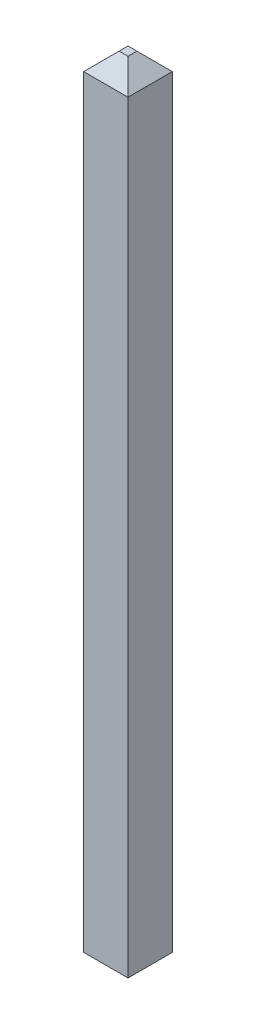
ISO-10303-21;
HEADER;
FILE_DESCRIPTION(('STEP AP214'),'2;1');
FILE_NAME('part.step','',(''),(''),'','','');
FILE_SCHEMA(('AUTOMOTIVE_DESIGN { 1 0 10303 214 1 1 1 1 }'));
ENDSEC;
DATA;
#1=APPLICATION_CONTEXT('core data for automotive mechanical design processes');
#2=APPLICATION_PROTOCOL_DEFINITION('international standard','automotive_design',2000,#1);
#3=PRODUCT_CONTEXT('',#1,'mechanical');
#4=PRODUCT('Part','Part','',(#3));
#5=PRODUCT_RELATED_PRODUCT_CATEGORY('part','',(#4));
#6=PRODUCT_DEFINITION_FORMATION('','',#4);
#7=PRODUCT_DEFINITION_CONTEXT('part definition',#1,'design');
#8=PRODUCT_DEFINITION('design','',#6,#7);
#9=PRODUCT_DEFINITION_SHAPE('','',#8);
#10=(LENGTH_UNIT() NAMED_UNIT(*) SI_UNIT(.MILLI.,.METRE.));
#11=(NAMED_UNIT(*) PLANE_ANGLE_UNIT() SI_UNIT($,.RADIAN.));
#12=(NAMED_UNIT(*) SI_UNIT($,.STERADIAN.) SOLID_ANGLE_UNIT());
#13=UNCERTAINTY_MEASURE_WITH_UNIT(LENGTH_MEASURE(1.E-05),#10,'distance_accuracy_value','');
#14=(GEOMETRIC_REPRESENTATION_CONTEXT(3) GLOBAL_UNCERTAINTY_ASSIGNED_CONTEXT((#13)) GLOBAL_UNIT_ASSIGNED_CONTEXT((#10,
#11,#12)) REPRESENTATION_CONTEXT('',''));
#15=CARTESIAN_POINT('',(0.,0.,0.));
#16=DIRECTION('',(0.,0.,1.));
#17=DIRECTION('',(1.,0.,0.));
#18=AXIS2_PLACEMENT_3D('',#15,#16,#17);
#19=CARTESIAN_POINT('',(-0.3175,11.43,-0.3175));
#20=DIRECTION('',(1.,0.,0.));
#21=DIRECTION('',(0.,0.,-1.));
#22=AXIS2_PLACEMENT_3D('',#19,#20,#21);
#23=PLANE('',#22);
#24=DIRECTION('',(0.,-1.,0.));
#25=VECTOR('',#24,1.);
#26=CARTESIAN_POINT('',(-0.3175,11.43,-0.3175));
#27=LINE('',#26,#25);
#28=CARTESIAN_POINT('',(-0.3175,11.176,-0.3175));
#29=VERTEX_POINT('',#28);
#30=CARTESIAN_POINT('',(-0.3175,0.254000000000001,-0.3175));
#31=VERTEX_POINT('',#30);
#32=EDGE_CURVE('E143',#29,#31,#27,.T.);
#33=ORIENTED_EDGE('',*,*,#32,.T.);
#34=DIRECTION('',(0.,0.,1.));
#35=VECTOR('',#34,1.);
#36=CARTESIAN_POINT('',(-0.3175,0.254000000000001,-0.3175));
#37=LINE('',#36,#35);
#38=CARTESIAN_POINT('',(-0.3175,0.254000000000001,0.3175));
#39=VERTEX_POINT('',#38);
#40=EDGE_CURVE('E136',#31,#39,#37,.T.);
#41=ORIENTED_EDGE('',*,*,#40,.T.);
#42=DIRECTION('',(0.,-1.,0.));
#43=VECTOR('',#42,1.);
#44=CARTESIAN_POINT('',(-0.3175,11.43,0.3175));
#45=LINE('',#44,#43);
#46=CARTESIAN_POINT('',(-0.3175,11.176,0.3175));
#47=VERTEX_POINT('',#46);
#48=EDGE_CURVE('E120',#47,#39,#45,.T.);
#49=ORIENTED_EDGE('',*,*,#48,.F.);
#50=DIRECTION('',(0.,0.,-1.));
#51=VECTOR('',#50,1.);
#52=CARTESIAN_POINT('',(-0.3175,11.176,-0.3175));
#53=LINE('',#52,#51);
#54=EDGE_CURVE('E135',#47,#29,#53,.T.);
#55=ORIENTED_EDGE('',*,*,#54,.T.);
#56=EDGE_LOOP('',(#33,#41,#49,#55));
#57=FACE_BOUND('',#56,.T.);
#58=ADVANCED_FACE('F33',(#57),#23,.F.);
#59=CARTESIAN_POINT('',(-0.3175,11.43,0.3175));
#60=DIRECTION('',(0.,0.,-1.));
#61=DIRECTION('',(-1.,0.,0.));
#62=AXIS2_PLACEMENT_3D('',#59,#60,#61);
#63=PLANE('',#62);
#64=ORIENTED_EDGE('',*,*,#48,.T.);
#65=DIRECTION('',(1.,0.,0.));
#66=VECTOR('',#65,1.);
#67=CARTESIAN_POINT('',(-0.3175,0.254000000000001,0.3175));
#68=LINE('',#67,#66);
#69=CARTESIAN_POINT('',(0.3175,0.254000000000001,0.3175));
#70=VERTEX_POINT('',#69);
#71=EDGE_CURVE('E11',#39,#70,#68,.T.);
#72=ORIENTED_EDGE('',*,*,#71,.T.);
#73=DIRECTION('',(0.,-1.,0.));
#74=VECTOR('',#73,1.);
#75=CARTESIAN_POINT('',(0.3175,11.43,0.3175));
#76=LINE('',#75,#74);
#77=CARTESIAN_POINT('',(0.3175,11.176,0.3175));
#78=VERTEX_POINT('',#77);
#79=EDGE_CURVE('E189',#78,#70,#76,.T.);
#80=ORIENTED_EDGE('',*,*,#79,.F.);
#81=DIRECTION('',(-1.,0.,0.));
#82=VECTOR('',#81,1.);
#83=CARTESIAN_POINT('',(-0.3175,11.176,0.3175));
#84=LINE('',#83,#82);
#85=EDGE_CURVE('E133',#78,#47,#84,.T.);
#86=ORIENTED_EDGE('',*,*,#85,.T.);
#87=EDGE_LOOP('',(#64,#72,#80,#86));
#88=FACE_BOUND('',#87,.T.);
#89=ADVANCED_FACE('F187',(#88),#63,.F.);
#90=CARTESIAN_POINT('',(0.3175,11.43,-0.3175));
#91=DIRECTION('',(-1.,0.,0.));
#92=DIRECTION('',(0.,0.,1.));
#93=AXIS2_PLACEMENT_3D('',#90,#91,#92);
#94=PLANE('',#93);
#95=ORIENTED_EDGE('',*,*,#79,.T.);
#96=DIRECTION('',(0.,0.,-1.));
#97=VECTOR('',#96,1.);
#98=CARTESIAN_POINT('',(0.3175,0.254000000000001,-0.3175));
#99=LINE('',#98,#97);
#100=CARTESIAN_POINT('',(0.3175,0.254000000000001,-0.3175));
#101=VERTEX_POINT('',#100);
#102=EDGE_CURVE('E42',#70,#101,#99,.T.);
#103=ORIENTED_EDGE('',*,*,#102,.T.);
#104=DIRECTION('',(0.,-1.,0.));
#105=VECTOR('',#104,1.);
#106=CARTESIAN_POINT('',(0.3175,11.43,-0.3175));
#107=LINE('',#106,#105);
#108=CARTESIAN_POINT('',(0.3175,11.176,-0.3175));
#109=VERTEX_POINT('',#108);
#110=EDGE_CURVE('E191',#109,#101,#107,.T.);
#111=ORIENTED_EDGE('',*,*,#110,.F.);
#112=DIRECTION('',(0.,0.,1.));
#113=VECTOR('',#112,1.);
#114=CARTESIAN_POINT('',(0.3175,11.176,0.3175));
#115=LINE('',#114,#113);
#116=EDGE_CURVE('E127',#109,#78,#115,.T.);
#117=ORIENTED_EDGE('',*,*,#116,.T.);
#118=EDGE_LOOP('',(#95,#103,#111,#117));
#119=FACE_BOUND('',#118,.T.);
#120=ADVANCED_FACE('F202',(#119),#94,.F.);
#121=CARTESIAN_POINT('',(-0.3175,11.43,-0.3175));
#122=DIRECTION('',(0.,0.,1.));
#123=DIRECTION('',(1.,0.,0.));
#124=AXIS2_PLACEMENT_3D('',#121,#122,#123);
#125=PLANE('',#124);
#126=ORIENTED_EDGE('',*,*,#110,.T.);
#127=DIRECTION('',(-1.,0.,0.));
#128=VECTOR('',#127,1.);
#129=CARTESIAN_POINT('',(-0.3175,0.254000000000001,-0.3175));
#130=LINE('',#129,#128);
#131=EDGE_CURVE('E155',#101,#31,#130,.T.);
#132=ORIENTED_EDGE('',*,*,#131,.T.);
#133=ORIENTED_EDGE('',*,*,#32,.F.);
#134=DIRECTION('',(1.,0.,0.));
#135=VECTOR('',#134,1.);
#136=CARTESIAN_POINT('',(0.3175,11.176,-0.3175));
#137=LINE('',#136,#135);
#138=EDGE_CURVE('E107',#29,#109,#137,.T.);
#139=ORIENTED_EDGE('',*,*,#138,.T.);
#140=EDGE_LOOP('',(#126,#132,#133,#139));
#141=FACE_BOUND('',#140,.T.);
#142=ADVANCED_FACE('F201',(#141),#125,.F.);
#143=CARTESIAN_POINT('',(-0.3175,11.43,0.3175));
#144=DIRECTION('',(0.,1.,0.));
#145=DIRECTION('',(0.,0.,1.));
#146=AXIS2_PLACEMENT_3D('',#143,#144,#145);
#147=PLANE('',#146);
#148=DIRECTION('',(0.,0.,-1.));
#149=VECTOR('',#148,1.);
#150=CARTESIAN_POINT('',(0.0635000000000009,11.43,-0.3175));
#151=LINE('',#150,#149);
#152=CARTESIAN_POINT('',(0.0635000000000009,11.43,0.063500000000001));
#153=VERTEX_POINT('',#152);
#154=CARTESIAN_POINT('',(0.0635000000000009,11.43,-0.063500000000001));
#155=VERTEX_POINT('',#154);
#156=EDGE_CURVE('E124',#153,#155,#151,.T.);
#157=ORIENTED_EDGE('',*,*,#156,.T.);
#158=DIRECTION('',(-1.,0.,0.));
#159=VECTOR('',#158,1.);
#160=CARTESIAN_POINT('',(-0.3175,11.43,-0.063500000000001));
#161=LINE('',#160,#159);
#162=CARTESIAN_POINT('',(-0.0635000000000011,11.43,-0.063500000000001));
#163=VERTEX_POINT('',#162);
#164=EDGE_CURVE('E105',#155,#163,#161,.T.);
#165=ORIENTED_EDGE('',*,*,#164,.T.);
#166=DIRECTION('',(0.,0.,1.));
#167=VECTOR('',#166,1.);
#168=CARTESIAN_POINT('',(-0.0635000000000011,11.43,0.3175));
#169=LINE('',#168,#167);
#170=CARTESIAN_POINT('',(-0.0635000000000011,11.43,0.063500000000001));
#171=VERTEX_POINT('',#170);
#172=EDGE_CURVE('E113',#163,#171,#169,.T.);
#173=ORIENTED_EDGE('',*,*,#172,.T.);
#174=DIRECTION('',(1.,0.,0.));
#175=VECTOR('',#174,1.);
#176=CARTESIAN_POINT('',(0.3175,11.43,0.063500000000001));
#177=LINE('',#176,#175);
#178=EDGE_CURVE('E119',#171,#153,#177,.T.);
#179=ORIENTED_EDGE('',*,*,#178,.T.);
#180=EDGE_LOOP('',(#157,#165,#173,#179));
#181=FACE_BOUND('',#180,.T.);
#182=ADVANCED_FACE('F122',(#181),#147,.T.);
#183=CARTESIAN_POINT('',(-0.3175,0.,0.3175));
#184=DIRECTION('',(0.,1.,0.));
#185=DIRECTION('',(0.,0.,1.));
#186=AXIS2_PLACEMENT_3D('',#183,#184,#185);
#187=PLANE('',#186);
#188=DIRECTION('',(-1.,0.,0.));
#189=VECTOR('',#188,1.);
#190=CARTESIAN_POINT('',(-0.3175,0.,0.0634999999999976));
#191=LINE('',#190,#189);
#192=CARTESIAN_POINT('',(0.0634999999999974,0.,0.0634999999999976));
#193=VERTEX_POINT('',#192);
#194=CARTESIAN_POINT('',(-0.0634999999999977,0.,0.0634999999999976));
#195=VERTEX_POINT('',#194);
#196=EDGE_CURVE('E146',#193,#195,#191,.T.);
#197=ORIENTED_EDGE('',*,*,#196,.T.);
#198=DIRECTION('',(0.,0.,-1.));
#199=VECTOR('',#198,1.);
#200=CARTESIAN_POINT('',(-0.0634999999999976,0.,0.3175));
#201=LINE('',#200,#199);
#202=CARTESIAN_POINT('',(-0.0634999999999977,0.,-0.0634999999999976));
#203=VERTEX_POINT('',#202);
#204=EDGE_CURVE('E152',#195,#203,#201,.T.);
#205=ORIENTED_EDGE('',*,*,#204,.T.);
#206=DIRECTION('',(1.,0.,0.));
#207=VECTOR('',#206,1.);
#208=CARTESIAN_POINT('',(-0.3175,0.,-0.0634999999999976));
#209=LINE('',#208,#207);
#210=CARTESIAN_POINT('',(0.0634999999999974,0.,-0.0634999999999976));
#211=VERTEX_POINT('',#210);
#212=EDGE_CURVE('E150',#203,#211,#209,.T.);
#213=ORIENTED_EDGE('',*,*,#212,.T.);
#214=DIRECTION('',(0.,0.,1.));
#215=VECTOR('',#214,1.);
#216=CARTESIAN_POINT('',(0.0634999999999975,0.,0.3175));
#217=LINE('',#216,#215);
#218=EDGE_CURVE('E148',#211,#193,#217,.T.);
#219=ORIENTED_EDGE('',*,*,#218,.T.);
#220=EDGE_LOOP('',(#197,#205,#213,#219));
#221=FACE_BOUND('',#220,.T.);
#222=ADVANCED_FACE('F176',(#221),#187,.F.);
#223=CARTESIAN_POINT('',(-0.3175,11.43,0.063500000000001));
#224=DIRECTION('',(0.,0.707106781186545,0.70710678118655));
#225=DIRECTION('',(0.,-0.70710678118655,0.707106781186545));
#226=AXIS2_PLACEMENT_3D('',#223,#224,#225);
#227=PLANE('',#226);
#228=DIRECTION('',(0.577350269189624,0.577350269189628,-0.577350269189624));
#229=VECTOR('',#228,1.);
#230=CARTESIAN_POINT('',(-0.148166666666667,11.3453333333333,0.148166666666667));
#231=LINE('',#230,#229);
#232=EDGE_CURVE('E116',#47,#171,#231,.T.);
#233=ORIENTED_EDGE('',*,*,#232,.F.);
#234=ORIENTED_EDGE('',*,*,#85,.F.);
#235=DIRECTION('',(-0.577350269189625,0.577350269189628,-0.577350269189624));
#236=VECTOR('',#235,1.);
#237=CARTESIAN_POINT('',(-0.0634999999999988,11.557,-0.0634999999999988));
#238=LINE('',#237,#236);
#239=EDGE_CURVE('E140',#153,#78,#238,.F.);
#240=ORIENTED_EDGE('',*,*,#239,.F.);
#241=ORIENTED_EDGE('',*,*,#178,.F.);
#242=EDGE_LOOP('',(#233,#234,#240,#241));
#243=FACE_BOUND('',#242,.T.);
#244=ADVANCED_FACE('F196',(#243),#227,.T.);
#245=CARTESIAN_POINT('',(0.0635000000000009,11.43,0.3175));
#246=DIRECTION('',(0.70710678118655,0.707106781186545,0.));
#247=DIRECTION('',(-0.707106781186545,0.70710678118655,0.));
#248=AXIS2_PLACEMENT_3D('',#245,#246,#247);
#249=PLANE('',#248);
#250=ORIENTED_EDGE('',*,*,#239,.T.);
#251=ORIENTED_EDGE('',*,*,#116,.F.);
#252=DIRECTION('',(-0.577350269189624,0.577350269189628,0.577350269189624));
#253=VECTOR('',#252,1.);
#254=CARTESIAN_POINT('',(-0.0634999999999988,11.557,0.0634999999999987));
#255=LINE('',#254,#253);
#256=EDGE_CURVE('E110',#155,#109,#255,.F.);
#257=ORIENTED_EDGE('',*,*,#256,.F.);
#258=ORIENTED_EDGE('',*,*,#156,.F.);
#259=EDGE_LOOP('',(#250,#251,#257,#258));
#260=FACE_BOUND('',#259,.T.);
#261=ADVANCED_FACE('F199',(#260),#249,.T.);
#262=CARTESIAN_POINT('',(-0.0635000000000011,11.43,0.3175));
#263=DIRECTION('',(-0.70710678118655,0.707106781186545,0.));
#264=DIRECTION('',(-0.707106781186545,-0.70710678118655,0.));
#265=AXIS2_PLACEMENT_3D('',#262,#263,#264);
#266=PLANE('',#265);
#267=ORIENTED_EDGE('',*,*,#232,.T.);
#268=ORIENTED_EDGE('',*,*,#172,.F.);
#269=DIRECTION('',(-0.577350269189625,-0.577350269189628,-0.577350269189624));
#270=VECTOR('',#269,1.);
#271=CARTESIAN_POINT('',(0.0634999999999987,11.557,0.0634999999999987));
#272=LINE('',#271,#270);
#273=EDGE_CURVE('E101',#29,#163,#272,.F.);
#274=ORIENTED_EDGE('',*,*,#273,.F.);
#275=ORIENTED_EDGE('',*,*,#54,.F.);
#276=EDGE_LOOP('',(#267,#268,#274,#275));
#277=FACE_BOUND('',#276,.T.);
#278=ADVANCED_FACE('F114',(#277),#266,.T.);
#279=CARTESIAN_POINT('',(-0.3175,11.43,-0.063500000000001));
#280=DIRECTION('',(0.,0.707106781186545,-0.70710678118655));
#281=DIRECTION('',(0.,0.70710678118655,0.707106781186545));
#282=AXIS2_PLACEMENT_3D('',#279,#280,#281);
#283=PLANE('',#282);
#284=ORIENTED_EDGE('',*,*,#256,.T.);
#285=ORIENTED_EDGE('',*,*,#138,.F.);
#286=ORIENTED_EDGE('',*,*,#273,.T.);
#287=ORIENTED_EDGE('',*,*,#164,.F.);
#288=EDGE_LOOP('',(#284,#285,#286,#287));
#289=FACE_BOUND('',#288,.T.);
#290=ADVANCED_FACE('F103',(#289),#283,.T.);
#291=CARTESIAN_POINT('',(0.3175,0.254000000000001,-0.3175));
#292=DIRECTION('',(-0.707106781186545,0.70710678118655,0.));
#293=DIRECTION('',(-0.70710678118655,-0.707106781186545,0.));
#294=AXIS2_PLACEMENT_3D('',#291,#292,#293);
#295=PLANE('',#294);
#296=DIRECTION('',(0.577350269189627,0.577350269189623,0.577350269189627));
#297=VECTOR('',#296,1.);
#298=CARTESIAN_POINT('',(0.105833333333332,0.0423333333333345,0.105833333333332));
#299=LINE('',#298,#297);
#300=EDGE_CURVE('E161',#193,#70,#299,.T.);
#301=ORIENTED_EDGE('',*,*,#300,.F.);
#302=ORIENTED_EDGE('',*,*,#218,.F.);
#303=DIRECTION('',(0.577350269189627,0.577350269189623,-0.577350269189627));
#304=VECTOR('',#303,1.);
#305=CARTESIAN_POINT('',(0.3175,0.254000000000001,-0.3175));
#306=LINE('',#305,#304);
#307=EDGE_CURVE('E37',#101,#211,#306,.F.);
#308=ORIENTED_EDGE('',*,*,#307,.F.);
#309=ORIENTED_EDGE('',*,*,#102,.F.);
#310=EDGE_LOOP('',(#301,#302,#308,#309));
#311=FACE_BOUND('',#310,.T.);
#312=ADVANCED_FACE('F35',(#311),#295,.F.);
#313=CARTESIAN_POINT('',(-0.3175,0.254000000000001,-0.3175));
#314=DIRECTION('',(0.,0.70710678118655,0.707106781186545));
#315=DIRECTION('',(0.,-0.707106781186545,0.70710678118655));
#316=AXIS2_PLACEMENT_3D('',#313,#314,#315);
#317=PLANE('',#316);
#318=ORIENTED_EDGE('',*,*,#307,.T.);
#319=ORIENTED_EDGE('',*,*,#212,.F.);
#320=DIRECTION('',(-0.577350269189627,0.577350269189623,-0.577350269189627));
#321=VECTOR('',#320,1.);
#322=CARTESIAN_POINT('',(-0.3175,0.254000000000001,-0.3175));
#323=LINE('',#322,#321);
#324=EDGE_CURVE('E160',#31,#203,#323,.F.);
#325=ORIENTED_EDGE('',*,*,#324,.F.);
#326=ORIENTED_EDGE('',*,*,#131,.F.);
#327=EDGE_LOOP('',(#318,#319,#325,#326));
#328=FACE_BOUND('',#327,.T.);
#329=ADVANCED_FACE('F171',(#328),#317,.F.);
#330=CARTESIAN_POINT('',(-0.3175,0.254000000000001,0.3175));
#331=DIRECTION('',(0.,0.70710678118655,-0.707106781186545));
#332=DIRECTION('',(0.,0.707106781186545,0.70710678118655));
#333=AXIS2_PLACEMENT_3D('',#330,#331,#332);
#334=PLANE('',#333);
#335=ORIENTED_EDGE('',*,*,#300,.T.);
#336=ORIENTED_EDGE('',*,*,#71,.F.);
#337=DIRECTION('',(0.577350269189627,-0.577350269189623,-0.577350269189627));
#338=VECTOR('',#337,1.);
#339=CARTESIAN_POINT('',(-0.3175,0.254000000000001,0.3175));
#340=LINE('',#339,#338);
#341=EDGE_CURVE('E158',#195,#39,#340,.F.);
#342=ORIENTED_EDGE('',*,*,#341,.F.);
#343=ORIENTED_EDGE('',*,*,#196,.F.);
#344=EDGE_LOOP('',(#335,#336,#342,#343));
#345=FACE_BOUND('',#344,.T.);
#346=ADVANCED_FACE('F182',(#345),#334,.F.);
#347=CARTESIAN_POINT('',(-0.3175,0.254000000000001,-0.3175));
#348=DIRECTION('',(0.707106781186545,0.70710678118655,0.));
#349=DIRECTION('',(-0.70710678118655,0.707106781186545,0.));
#350=AXIS2_PLACEMENT_3D('',#347,#348,#349);
#351=PLANE('',#350);
#352=ORIENTED_EDGE('',*,*,#324,.T.);
#353=ORIENTED_EDGE('',*,*,#204,.F.);
#354=ORIENTED_EDGE('',*,*,#341,.T.);
#355=ORIENTED_EDGE('',*,*,#40,.F.);
#356=EDGE_LOOP('',(#352,#353,#354,#355));
#357=FACE_BOUND('',#356,.T.);
#358=ADVANCED_FACE('F180',(#357),#351,.F.);
#359=CLOSED_SHELL('',(#58,#89,#120,#142,#182,#222,#244,#261,#278,#290,#312,#329,#346,#358));
#360=MANIFOLD_SOLID_BREP('B2',#359);
#361=ADVANCED_BREP_SHAPE_REPRESENTATION('',(#18,#360),#14);
#362=SHAPE_DEFINITION_REPRESENTATION(#9,#361);
ENDSEC;
END-ISO-10303-21;
